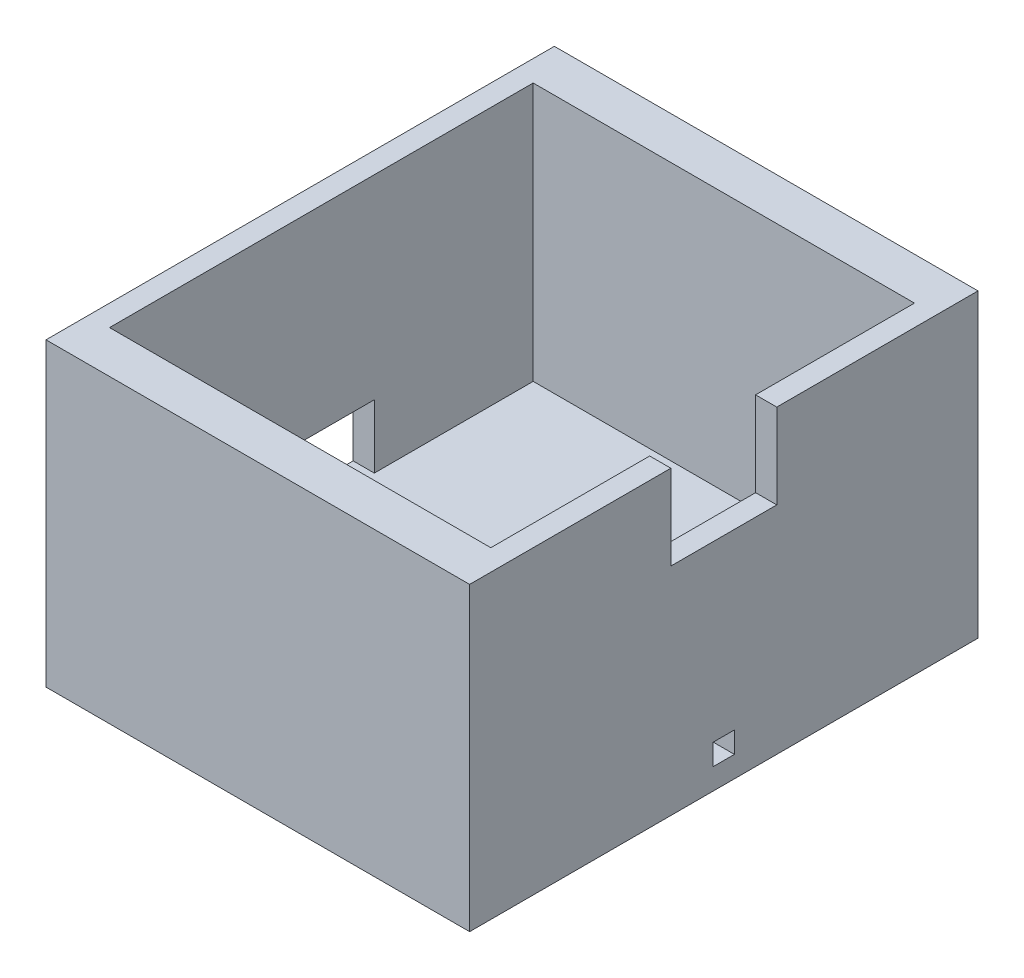
ISO-10303-21;
HEADER;
FILE_DESCRIPTION(('STEP AP214'),'2;1');
FILE_NAME('part.step','',(''),(''),'','','');
FILE_SCHEMA(('AUTOMOTIVE_DESIGN { 1 0 10303 214 1 1 1 1 }'));
ENDSEC;
DATA;
#1=APPLICATION_CONTEXT('core data for automotive mechanical design processes');
#2=APPLICATION_PROTOCOL_DEFINITION('international standard','automotive_design',2000,#1);
#3=PRODUCT_CONTEXT('',#1,'mechanical');
#4=PRODUCT('Part','Part','',(#3));
#5=PRODUCT_RELATED_PRODUCT_CATEGORY('part','',(#4));
#6=PRODUCT_DEFINITION_FORMATION('','',#4);
#7=PRODUCT_DEFINITION_CONTEXT('part definition',#1,'design');
#8=PRODUCT_DEFINITION('design','',#6,#7);
#9=PRODUCT_DEFINITION_SHAPE('','',#8);
#10=(LENGTH_UNIT() NAMED_UNIT(*) SI_UNIT(.MILLI.,.METRE.));
#11=(NAMED_UNIT(*) PLANE_ANGLE_UNIT() SI_UNIT($,.RADIAN.));
#12=(NAMED_UNIT(*) SI_UNIT($,.STERADIAN.) SOLID_ANGLE_UNIT());
#13=UNCERTAINTY_MEASURE_WITH_UNIT(LENGTH_MEASURE(1.E-05),#10,'distance_accuracy_value','');
#14=(GEOMETRIC_REPRESENTATION_CONTEXT(3) GLOBAL_UNCERTAINTY_ASSIGNED_CONTEXT((#13)) GLOBAL_UNIT_ASSIGNED_CONTEXT((#10,
#11,#12)) REPRESENTATION_CONTEXT('',''));
#15=CARTESIAN_POINT('',(0.,0.,0.));
#16=DIRECTION('',(0.,0.,1.));
#17=DIRECTION('',(1.,0.,0.));
#18=AXIS2_PLACEMENT_3D('',#15,#16,#17);
#19=CARTESIAN_POINT('',(0.,10.,0.));
#20=DIRECTION('',(0.,1.,0.));
#21=DIRECTION('',(0.,0.,1.));
#22=AXIS2_PLACEMENT_3D('',#19,#20,#21);
#23=PLANE('',#22);
#24=DIRECTION('',(0.,0.,1.));
#25=VECTOR('',#24,1.);
#26=CARTESIAN_POINT('',(-45.,10.,-50.));
#27=LINE('',#26,#25);
#28=CARTESIAN_POINT('',(-45.,10.,-50.));
#29=VERTEX_POINT('',#28);
#30=CARTESIAN_POINT('',(-45.,10.,-12.5));
#31=VERTEX_POINT('',#30);
#32=EDGE_CURVE('E237',#29,#31,#27,.T.);
#33=ORIENTED_EDGE('',*,*,#32,.T.);
#34=DIRECTION('',(-1.,0.,0.));
#35=VECTOR('',#34,1.);
#36=CARTESIAN_POINT('',(-21.,10.,-12.5));
#37=LINE('',#36,#35);
#38=CARTESIAN_POINT('',(-50.,10.,-12.5));
#39=VERTEX_POINT('',#38);
#40=EDGE_CURVE('E225',#31,#39,#37,.T.);
#41=ORIENTED_EDGE('',*,*,#40,.T.);
#42=DIRECTION('',(0.,0.,1.));
#43=VECTOR('',#42,1.);
#44=CARTESIAN_POINT('',(-50.,10.,-12.5));
#45=LINE('',#44,#43);
#46=CARTESIAN_POINT('',(-50.,10.,-2.5));
#47=VERTEX_POINT('',#46);
#48=EDGE_CURVE('E216',#39,#47,#45,.T.);
#49=ORIENTED_EDGE('',*,*,#48,.T.);
#50=DIRECTION('',(-1.,0.,0.));
#51=VECTOR('',#50,1.);
#52=CARTESIAN_POINT('',(-50.,10.,-2.5));
#53=LINE('',#52,#51);
#54=CARTESIAN_POINT('',(45.,10.,-2.5));
#55=VERTEX_POINT('',#54);
#56=EDGE_CURVE('E311',#55,#47,#53,.T.);
#57=ORIENTED_EDGE('',*,*,#56,.F.);
#58=DIRECTION('',(0.,0.,-1.));
#59=VECTOR('',#58,1.);
#60=CARTESIAN_POINT('',(45.,10.,-50.));
#61=LINE('',#60,#59);
#62=CARTESIAN_POINT('',(45.,10.,-50.));
#63=VERTEX_POINT('',#62);
#64=EDGE_CURVE('E249',#55,#63,#61,.T.);
#65=ORIENTED_EDGE('',*,*,#64,.T.);
#66=DIRECTION('',(-1.,0.,0.));
#67=VECTOR('',#66,1.);
#68=CARTESIAN_POINT('',(-45.,10.,-50.));
#69=LINE('',#68,#67);
#70=EDGE_CURVE('E253',#63,#29,#69,.T.);
#71=ORIENTED_EDGE('',*,*,#70,.T.);
#72=EDGE_LOOP('',(#33,#41,#49,#57,#65,#71));
#73=FACE_BOUND('',#72,.T.);
#74=ADVANCED_FACE('F39',(#73),#23,.T.);
#75=CARTESIAN_POINT('',(-50.,10.,60.));
#76=DIRECTION('',(1.,0.,0.));
#77=DIRECTION('',(0.,0.,-1.));
#78=AXIS2_PLACEMENT_3D('',#75,#76,#77);
#79=PLANE('',#78);
#80=DIRECTION('',(0.,1.,0.));
#81=VECTOR('',#80,1.);
#82=CARTESIAN_POINT('',(-50.,10.,12.5));
#83=LINE('',#82,#81);
#84=CARTESIAN_POINT('',(-50.,10.,12.5));
#85=VERTEX_POINT('',#84);
#86=CARTESIAN_POINT('',(-50.,25.,12.5));
#87=VERTEX_POINT('',#86);
#88=EDGE_CURVE('E219',#85,#87,#83,.T.);
#89=ORIENTED_EDGE('',*,*,#88,.F.);
#90=CARTESIAN_POINT('',(-50.,10.,2.5));
#91=VERTEX_POINT('',#90);
#92=EDGE_CURVE('E215',#91,#85,#45,.T.);
#93=ORIENTED_EDGE('',*,*,#92,.F.);
#94=DIRECTION('',(0.,1.,0.));
#95=VECTOR('',#94,1.);
#96=CARTESIAN_POINT('',(-50.,5.,2.5));
#97=LINE('',#96,#95);
#98=CARTESIAN_POINT('',(-50.,5.,2.5));
#99=VERTEX_POINT('',#98);
#100=EDGE_CURVE('E308',#99,#91,#97,.T.);
#101=ORIENTED_EDGE('',*,*,#100,.F.);
#102=DIRECTION('',(0.,0.,1.));
#103=VECTOR('',#102,1.);
#104=CARTESIAN_POINT('',(-50.,5.,-2.5));
#105=LINE('',#104,#103);
#106=CARTESIAN_POINT('',(-50.,5.,-2.5));
#107=VERTEX_POINT('',#106);
#108=EDGE_CURVE('E296',#107,#99,#105,.T.);
#109=ORIENTED_EDGE('',*,*,#108,.F.);
#110=DIRECTION('',(0.,1.,0.));
#111=VECTOR('',#110,1.);
#112=CARTESIAN_POINT('',(-50.,5.,-2.5));
#113=LINE('',#112,#111);
#114=EDGE_CURVE('E314',#107,#47,#113,.T.);
#115=ORIENTED_EDGE('',*,*,#114,.T.);
#116=ORIENTED_EDGE('',*,*,#48,.F.);
#117=DIRECTION('',(0.,-1.,0.));
#118=VECTOR('',#117,1.);
#119=CARTESIAN_POINT('',(-50.,10.,-12.5));
#120=LINE('',#119,#118);
#121=CARTESIAN_POINT('',(-50.,25.,-12.5));
#122=VERTEX_POINT('',#121);
#123=EDGE_CURVE('E208',#122,#39,#120,.T.);
#124=ORIENTED_EDGE('',*,*,#123,.F.);
#125=DIRECTION('',(0.,0.,-1.));
#126=VECTOR('',#125,1.);
#127=CARTESIAN_POINT('',(-50.,25.,-12.5));
#128=LINE('',#127,#126);
#129=EDGE_CURVE('E222',#87,#122,#128,.T.);
#130=ORIENTED_EDGE('',*,*,#129,.F.);
#131=EDGE_LOOP('',(#89,#93,#101,#109,#115,#116,#124,#130));
#132=FACE_BOUND('',#131,.T.);
#133=DIRECTION('',(0.,0.,1.));
#134=VECTOR('',#133,1.);
#135=CARTESIAN_POINT('',(-50.,71.,-60.));
#136=LINE('',#135,#134);
#137=CARTESIAN_POINT('',(-50.,71.,-60.));
#138=VERTEX_POINT('',#137);
#139=CARTESIAN_POINT('',(-50.,71.,60.));
#140=VERTEX_POINT('',#139);
#141=EDGE_CURVE('E272',#138,#140,#136,.T.);
#142=ORIENTED_EDGE('',*,*,#141,.F.);
#143=DIRECTION('',(0.,-1.,0.));
#144=VECTOR('',#143,1.);
#145=CARTESIAN_POINT('',(-50.,10.,-60.));
#146=LINE('',#145,#144);
#147=CARTESIAN_POINT('',(-50.,0.,-60.));
#148=VERTEX_POINT('',#147);
#149=EDGE_CURVE('E334',#138,#148,#146,.T.);
#150=ORIENTED_EDGE('',*,*,#149,.T.);
#151=DIRECTION('',(0.,0.,1.));
#152=VECTOR('',#151,1.);
#153=CARTESIAN_POINT('',(-50.,0.,60.));
#154=LINE('',#153,#152);
#155=CARTESIAN_POINT('',(-50.,0.,60.));
#156=VERTEX_POINT('',#155);
#157=EDGE_CURVE('E317',#148,#156,#154,.T.);
#158=ORIENTED_EDGE('',*,*,#157,.T.);
#159=DIRECTION('',(0.,-1.,0.));
#160=VECTOR('',#159,1.);
#161=CARTESIAN_POINT('',(-50.,10.,60.));
#162=LINE('',#161,#160);
#163=EDGE_CURVE('E343',#140,#156,#162,.T.);
#164=ORIENTED_EDGE('',*,*,#163,.F.);
#165=EDGE_LOOP('',(#142,#150,#158,#164));
#166=FACE_BOUND('',#165,.T.);
#167=ADVANCED_FACE('F41',(#132,#166),#79,.F.);
#168=CARTESIAN_POINT('',(50.,10.,60.));
#169=DIRECTION('',(0.,0.,-1.));
#170=DIRECTION('',(-1.,0.,0.));
#171=AXIS2_PLACEMENT_3D('',#168,#169,#170);
#172=PLANE('',#171);
#173=DIRECTION('',(1.,0.,0.));
#174=VECTOR('',#173,1.);
#175=CARTESIAN_POINT('',(50.,0.,60.));
#176=LINE('',#175,#174);
#177=CARTESIAN_POINT('',(50.,0.,60.));
#178=VERTEX_POINT('',#177);
#179=EDGE_CURVE('E328',#156,#178,#176,.T.);
#180=ORIENTED_EDGE('',*,*,#179,.T.);
#181=DIRECTION('',(0.,-1.,0.));
#182=VECTOR('',#181,1.);
#183=CARTESIAN_POINT('',(50.,10.,60.));
#184=LINE('',#183,#182);
#185=CARTESIAN_POINT('',(50.,71.,60.));
#186=VERTEX_POINT('',#185);
#187=EDGE_CURVE('E340',#186,#178,#184,.T.);
#188=ORIENTED_EDGE('',*,*,#187,.F.);
#189=DIRECTION('',(1.,0.,0.));
#190=VECTOR('',#189,1.);
#191=CARTESIAN_POINT('',(50.,71.,60.));
#192=LINE('',#191,#190);
#193=EDGE_CURVE('E275',#140,#186,#192,.T.);
#194=ORIENTED_EDGE('',*,*,#193,.F.);
#195=ORIENTED_EDGE('',*,*,#163,.T.);
#196=EDGE_LOOP('',(#180,#188,#194,#195));
#197=FACE_BOUND('',#196,.T.);
#198=ADVANCED_FACE('F443',(#197),#172,.F.);
#199=CARTESIAN_POINT('',(50.,10.,60.));
#200=DIRECTION('',(-1.,0.,0.));
#201=DIRECTION('',(0.,0.,1.));
#202=AXIS2_PLACEMENT_3D('',#199,#200,#201);
#203=PLANE('',#202);
#204=DIRECTION('',(0.,0.,-1.));
#205=VECTOR('',#204,1.);
#206=CARTESIAN_POINT('',(50.,51.,12.5));
#207=LINE('',#206,#205);
#208=CARTESIAN_POINT('',(50.,51.,12.5));
#209=VERTEX_POINT('',#208);
#210=CARTESIAN_POINT('',(50.,51.,-12.5));
#211=VERTEX_POINT('',#210);
#212=EDGE_CURVE('E184',#209,#211,#207,.T.);
#213=ORIENTED_EDGE('',*,*,#212,.F.);
#214=DIRECTION('',(0.,-1.,0.));
#215=VECTOR('',#214,1.);
#216=CARTESIAN_POINT('',(50.,71.,12.5));
#217=LINE('',#216,#215);
#218=CARTESIAN_POINT('',(50.,71.,12.5));
#219=VERTEX_POINT('',#218);
#220=EDGE_CURVE('E193',#219,#209,#217,.T.);
#221=ORIENTED_EDGE('',*,*,#220,.F.);
#222=DIRECTION('',(0.,0.,-1.));
#223=VECTOR('',#222,1.);
#224=CARTESIAN_POINT('',(50.,71.,-60.));
#225=LINE('',#224,#223);
#226=EDGE_CURVE('E279',#186,#219,#225,.T.);
#227=ORIENTED_EDGE('',*,*,#226,.F.);
#228=ORIENTED_EDGE('',*,*,#187,.T.);
#229=DIRECTION('',(0.,0.,-1.));
#230=VECTOR('',#229,1.);
#231=CARTESIAN_POINT('',(50.,0.,60.));
#232=LINE('',#231,#230);
#233=CARTESIAN_POINT('',(50.,0.,-60.));
#234=VERTEX_POINT('',#233);
#235=EDGE_CURVE('E330',#178,#234,#232,.T.);
#236=ORIENTED_EDGE('',*,*,#235,.T.);
#237=DIRECTION('',(0.,-1.,0.));
#238=VECTOR('',#237,1.);
#239=CARTESIAN_POINT('',(50.,10.,-60.));
#240=LINE('',#239,#238);
#241=CARTESIAN_POINT('',(50.,71.,-60.));
#242=VERTEX_POINT('',#241);
#243=EDGE_CURVE('E337',#242,#234,#240,.T.);
#244=ORIENTED_EDGE('',*,*,#243,.F.);
#245=CARTESIAN_POINT('',(50.,71.,-12.5));
#246=VERTEX_POINT('',#245);
#247=EDGE_CURVE('E278',#246,#242,#225,.T.);
#248=ORIENTED_EDGE('',*,*,#247,.F.);
#249=DIRECTION('',(0.,1.,0.));
#250=VECTOR('',#249,1.);
#251=CARTESIAN_POINT('',(50.,71.,-12.5));
#252=LINE('',#251,#250);
#253=EDGE_CURVE('E190',#211,#246,#252,.T.);
#254=ORIENTED_EDGE('',*,*,#253,.F.);
#255=EDGE_LOOP('',(#213,#221,#227,#228,#236,#244,#248,#254));
#256=FACE_BOUND('',#255,.T.);
#257=DIRECTION('',(0.,0.,-1.));
#258=VECTOR('',#257,1.);
#259=CARTESIAN_POINT('',(50.,10.,-60.));
#260=LINE('',#259,#258);
#261=CARTESIAN_POINT('',(50.,10.,2.5));
#262=VERTEX_POINT('',#261);
#263=CARTESIAN_POINT('',(50.,10.,-2.5));
#264=VERTEX_POINT('',#263);
#265=EDGE_CURVE('E268',#262,#264,#260,.T.);
#266=ORIENTED_EDGE('',*,*,#265,.T.);
#267=DIRECTION('',(0.,1.,0.));
#268=VECTOR('',#267,1.);
#269=CARTESIAN_POINT('',(50.,5.,-2.5));
#270=LINE('',#269,#268);
#271=CARTESIAN_POINT('',(50.,5.,-2.5));
#272=VERTEX_POINT('',#271);
#273=EDGE_CURVE('E318',#272,#264,#270,.T.);
#274=ORIENTED_EDGE('',*,*,#273,.F.);
#275=DIRECTION('',(0.,0.,-1.));
#276=VECTOR('',#275,1.);
#277=CARTESIAN_POINT('',(50.,5.,-2.5));
#278=LINE('',#277,#276);
#279=CARTESIAN_POINT('',(50.,5.,2.5));
#280=VERTEX_POINT('',#279);
#281=EDGE_CURVE('E303',#280,#272,#278,.T.);
#282=ORIENTED_EDGE('',*,*,#281,.F.);
#283=DIRECTION('',(0.,1.,0.));
#284=VECTOR('',#283,1.);
#285=CARTESIAN_POINT('',(50.,5.,2.5));
#286=LINE('',#285,#284);
#287=EDGE_CURVE('E321',#280,#262,#286,.T.);
#288=ORIENTED_EDGE('',*,*,#287,.T.);
#289=EDGE_LOOP('',(#266,#274,#282,#288));
#290=FACE_BOUND('',#289,.T.);
#291=ADVANCED_FACE('F201',(#256,#290),#203,.F.);
#292=CARTESIAN_POINT('',(50.,10.,-60.));
#293=DIRECTION('',(0.,0.,1.));
#294=DIRECTION('',(1.,0.,0.));
#295=AXIS2_PLACEMENT_3D('',#292,#293,#294);
#296=PLANE('',#295);
#297=DIRECTION('',(-1.,0.,0.));
#298=VECTOR('',#297,1.);
#299=CARTESIAN_POINT('',(50.,0.,-60.));
#300=LINE('',#299,#298);
#301=EDGE_CURVE('E332',#234,#148,#300,.T.);
#302=ORIENTED_EDGE('',*,*,#301,.T.);
#303=ORIENTED_EDGE('',*,*,#149,.F.);
#304=DIRECTION('',(-1.,0.,0.));
#305=VECTOR('',#304,1.);
#306=CARTESIAN_POINT('',(50.,71.,-60.));
#307=LINE('',#306,#305);
#308=EDGE_CURVE('E269',#242,#138,#307,.T.);
#309=ORIENTED_EDGE('',*,*,#308,.F.);
#310=ORIENTED_EDGE('',*,*,#243,.T.);
#311=EDGE_LOOP('',(#302,#303,#309,#310));
#312=FACE_BOUND('',#311,.T.);
#313=ADVANCED_FACE('F372',(#312),#296,.F.);
#314=DIRECTION('',(-1.,0.,0.));
#315=VECTOR('',#314,1.);
#316=CARTESIAN_POINT('',(-21.,10.,12.5));
#317=LINE('',#316,#315);
#318=CARTESIAN_POINT('',(-45.,10.,12.5));
#319=VERTEX_POINT('',#318);
#320=EDGE_CURVE('E231',#319,#85,#317,.T.);
#321=ORIENTED_EDGE('',*,*,#320,.F.);
#322=CARTESIAN_POINT('',(-45.,10.,50.));
#323=VERTEX_POINT('',#322);
#324=EDGE_CURVE('E256',#319,#323,#27,.T.);
#325=ORIENTED_EDGE('',*,*,#324,.T.);
#326=DIRECTION('',(1.,0.,0.));
#327=VECTOR('',#326,1.);
#328=CARTESIAN_POINT('',(45.,10.,50.));
#329=LINE('',#328,#327);
#330=CARTESIAN_POINT('',(45.,10.,50.));
#331=VERTEX_POINT('',#330);
#332=EDGE_CURVE('E228',#323,#331,#329,.T.);
#333=ORIENTED_EDGE('',*,*,#332,.T.);
#334=CARTESIAN_POINT('',(45.,10.,2.5));
#335=VERTEX_POINT('',#334);
#336=EDGE_CURVE('E250',#331,#335,#61,.T.);
#337=ORIENTED_EDGE('',*,*,#336,.T.);
#338=DIRECTION('',(1.,0.,0.));
#339=VECTOR('',#338,1.);
#340=CARTESIAN_POINT('',(-50.,10.,2.5));
#341=LINE('',#340,#339);
#342=EDGE_CURVE('E309',#91,#335,#341,.T.);
#343=ORIENTED_EDGE('',*,*,#342,.F.);
#344=ORIENTED_EDGE('',*,*,#92,.T.);
#345=EDGE_LOOP('',(#321,#325,#333,#337,#343,#344));
#346=FACE_BOUND('',#345,.T.);
#347=CARTESIAN_POINT('',(13.1,10.,18.7266881758464));
#348=DIRECTION('',(0.,1.,0.));
#349=DIRECTION('',(0.,0.,1.));
#350=AXIS2_PLACEMENT_3D('',#347,#348,#349);
#351=CIRCLE('',#350,2.);
#352=CARTESIAN_POINT('',(13.1,10.,20.7266881758464));
#353=VERTEX_POINT('',#352);
#354=EDGE_CURVE('E288',#353,#353,#351,.T.);
#355=ORIENTED_EDGE('',*,*,#354,.F.);
#356=EDGE_LOOP('',(#355));
#357=FACE_BOUND('',#356,.T.);
#358=CARTESIAN_POINT('',(-36.9,10.,18.7266881758464));
#359=DIRECTION('',(0.,1.,0.));
#360=DIRECTION('',(0.,0.,1.));
#361=AXIS2_PLACEMENT_3D('',#358,#359,#360);
#362=CIRCLE('',#361,2.);
#363=CARTESIAN_POINT('',(-36.9,10.,20.7266881758464));
#364=VERTEX_POINT('',#363);
#365=EDGE_CURVE('E291',#364,#364,#362,.T.);
#366=ORIENTED_EDGE('',*,*,#365,.F.);
#367=EDGE_LOOP('',(#366));
#368=FACE_BOUND('',#367,.T.);
#369=ADVANCED_FACE('F388',(#346,#357,#368),#23,.T.);
#370=CARTESIAN_POINT('',(0.,0.,0.));
#371=DIRECTION('',(0.,1.,0.));
#372=DIRECTION('',(0.,0.,1.));
#373=AXIS2_PLACEMENT_3D('',#370,#371,#372);
#374=PLANE('',#373);
#375=CARTESIAN_POINT('',(13.1,0.,18.7266881758464));
#376=DIRECTION('',(0.,1.,0.));
#377=DIRECTION('',(0.,0.,1.));
#378=AXIS2_PLACEMENT_3D('',#375,#376,#377);
#379=CIRCLE('',#378,2.);
#380=CARTESIAN_POINT('',(13.1,0.,20.7266881758464));
#381=VERTEX_POINT('',#380);
#382=EDGE_CURVE('E284',#381,#381,#379,.T.);
#383=ORIENTED_EDGE('',*,*,#382,.T.);
#384=EDGE_LOOP('',(#383));
#385=FACE_BOUND('',#384,.T.);
#386=CARTESIAN_POINT('',(-36.9,0.,18.7266881758464));
#387=DIRECTION('',(0.,1.,0.));
#388=DIRECTION('',(0.,0.,1.));
#389=AXIS2_PLACEMENT_3D('',#386,#387,#388);
#390=CIRCLE('',#389,2.);
#391=CARTESIAN_POINT('',(-36.9,0.,20.7266881758464));
#392=VERTEX_POINT('',#391);
#393=EDGE_CURVE('E281',#392,#392,#390,.T.);
#394=ORIENTED_EDGE('',*,*,#393,.T.);
#395=EDGE_LOOP('',(#394));
#396=FACE_BOUND('',#395,.T.);
#397=ORIENTED_EDGE('',*,*,#157,.F.);
#398=ORIENTED_EDGE('',*,*,#301,.F.);
#399=ORIENTED_EDGE('',*,*,#235,.F.);
#400=ORIENTED_EDGE('',*,*,#179,.F.);
#401=EDGE_LOOP('',(#397,#398,#399,#400));
#402=FACE_BOUND('',#401,.T.);
#403=ADVANCED_FACE('F370',(#385,#396,#402),#374,.F.);
#404=CARTESIAN_POINT('',(-50.,5.,-2.5));
#405=DIRECTION('',(0.,0.,-1.));
#406=DIRECTION('',(-1.,0.,0.));
#407=AXIS2_PLACEMENT_3D('',#404,#405,#406);
#408=PLANE('',#407);
#409=EDGE_CURVE('E300',#264,#55,#53,.T.);
#410=ORIENTED_EDGE('',*,*,#409,.T.);
#411=ORIENTED_EDGE('',*,*,#56,.T.);
#412=ORIENTED_EDGE('',*,*,#114,.F.);
#413=DIRECTION('',(-1.,0.,0.));
#414=VECTOR('',#413,1.);
#415=CARTESIAN_POINT('',(-50.,5.,-2.5));
#416=LINE('',#415,#414);
#417=EDGE_CURVE('E305',#272,#107,#416,.T.);
#418=ORIENTED_EDGE('',*,*,#417,.F.);
#419=ORIENTED_EDGE('',*,*,#273,.T.);
#420=EDGE_LOOP('',(#410,#411,#412,#418,#419));
#421=FACE_BOUND('',#420,.T.);
#422=ADVANCED_FACE('F414',(#421),#408,.F.);
#423=CARTESIAN_POINT('',(-50.,5.,2.5));
#424=DIRECTION('',(0.,0.,1.));
#425=DIRECTION('',(1.,0.,0.));
#426=AXIS2_PLACEMENT_3D('',#423,#424,#425);
#427=PLANE('',#426);
#428=ORIENTED_EDGE('',*,*,#342,.T.);
#429=EDGE_CURVE('E287',#335,#262,#341,.T.);
#430=ORIENTED_EDGE('',*,*,#429,.T.);
#431=ORIENTED_EDGE('',*,*,#287,.F.);
#432=DIRECTION('',(1.,0.,0.));
#433=VECTOR('',#432,1.);
#434=CARTESIAN_POINT('',(-50.,5.,2.5));
#435=LINE('',#434,#433);
#436=EDGE_CURVE('E299',#99,#280,#435,.T.);
#437=ORIENTED_EDGE('',*,*,#436,.F.);
#438=ORIENTED_EDGE('',*,*,#100,.T.);
#439=EDGE_LOOP('',(#428,#430,#431,#437,#438));
#440=FACE_BOUND('',#439,.T.);
#441=ADVANCED_FACE('F422',(#440),#427,.F.);
#442=CARTESIAN_POINT('',(0.,5.,0.));
#443=DIRECTION('',(0.,1.,0.));
#444=DIRECTION('',(0.,0.,1.));
#445=AXIS2_PLACEMENT_3D('',#442,#443,#444);
#446=PLANE('',#445);
#447=ORIENTED_EDGE('',*,*,#108,.T.);
#448=ORIENTED_EDGE('',*,*,#436,.T.);
#449=ORIENTED_EDGE('',*,*,#281,.T.);
#450=ORIENTED_EDGE('',*,*,#417,.T.);
#451=EDGE_LOOP('',(#447,#448,#449,#450));
#452=FACE_BOUND('',#451,.T.);
#453=ADVANCED_FACE('F417',(#452),#446,.T.);
#454=CARTESIAN_POINT('',(-36.9,0.,18.7266881758464));
#455=DIRECTION('',(0.,1.,0.));
#456=DIRECTION('',(0.,0.,1.));
#457=AXIS2_PLACEMENT_3D('',#454,#455,#456);
#458=CYLINDRICAL_SURFACE('',#457,2.);
#459=ORIENTED_EDGE('',*,*,#393,.F.);
#460=EDGE_LOOP('',(#459));
#461=FACE_BOUND('',#460,.T.);
#462=ORIENTED_EDGE('',*,*,#365,.T.);
#463=EDGE_LOOP('',(#462));
#464=FACE_BOUND('',#463,.T.);
#465=ADVANCED_FACE('F472',(#461,#464),#458,.F.);
#466=CARTESIAN_POINT('',(13.1,0.,18.7266881758464));
#467=DIRECTION('',(0.,1.,0.));
#468=DIRECTION('',(0.,0.,1.));
#469=AXIS2_PLACEMENT_3D('',#466,#467,#468);
#470=CYLINDRICAL_SURFACE('',#469,2.);
#471=ORIENTED_EDGE('',*,*,#382,.F.);
#472=EDGE_LOOP('',(#471));
#473=FACE_BOUND('',#472,.T.);
#474=ORIENTED_EDGE('',*,*,#354,.T.);
#475=EDGE_LOOP('',(#474));
#476=FACE_BOUND('',#475,.T.);
#477=ADVANCED_FACE('F468',(#473,#476),#470,.F.);
#478=CARTESIAN_POINT('',(0.,10.,0.));
#479=DIRECTION('',(0.,1.,0.));
#480=DIRECTION('',(0.,0.,1.));
#481=AXIS2_PLACEMENT_3D('',#478,#479,#480);
#482=PLANE('',#481);
#483=EDGE_CURVE('E62',#335,#55,#61,.T.);
#484=ORIENTED_EDGE('',*,*,#483,.T.);
#485=ORIENTED_EDGE('',*,*,#409,.F.);
#486=ORIENTED_EDGE('',*,*,#265,.F.);
#487=ORIENTED_EDGE('',*,*,#429,.F.);
#488=EDGE_LOOP('',(#484,#485,#486,#487));
#489=FACE_BOUND('',#488,.T.);
#490=ADVANCED_FACE('F419',(#489),#482,.F.);
#491=CARTESIAN_POINT('',(0.,71.,0.));
#492=DIRECTION('',(0.,1.,0.));
#493=DIRECTION('',(0.,0.,1.));
#494=AXIS2_PLACEMENT_3D('',#491,#492,#493);
#495=PLANE('',#494);
#496=DIRECTION('',(1.,0.,0.));
#497=VECTOR('',#496,1.);
#498=CARTESIAN_POINT('',(21.,71.,12.5));
#499=LINE('',#498,#497);
#500=CARTESIAN_POINT('',(45.,71.,12.5));
#501=VERTEX_POINT('',#500);
#502=EDGE_CURVE('E196',#501,#219,#499,.T.);
#503=ORIENTED_EDGE('',*,*,#502,.F.);
#504=DIRECTION('',(0.,0.,-1.));
#505=VECTOR('',#504,1.);
#506=CARTESIAN_POINT('',(45.,71.,-50.));
#507=LINE('',#506,#505);
#508=CARTESIAN_POINT('',(45.,71.,50.));
#509=VERTEX_POINT('',#508);
#510=EDGE_CURVE('E238',#509,#501,#507,.T.);
#511=ORIENTED_EDGE('',*,*,#510,.F.);
#512=DIRECTION('',(1.,0.,0.));
#513=VECTOR('',#512,1.);
#514=CARTESIAN_POINT('',(45.,71.,50.));
#515=LINE('',#514,#513);
#516=CARTESIAN_POINT('',(-45.,71.,50.));
#517=VERTEX_POINT('',#516);
#518=EDGE_CURVE('E234',#517,#509,#515,.T.);
#519=ORIENTED_EDGE('',*,*,#518,.F.);
#520=DIRECTION('',(0.,0.,1.));
#521=VECTOR('',#520,1.);
#522=CARTESIAN_POINT('',(-45.,71.,-50.));
#523=LINE('',#522,#521);
#524=CARTESIAN_POINT('',(-45.,71.,-50.));
#525=VERTEX_POINT('',#524);
#526=EDGE_CURVE('E244',#525,#517,#523,.T.);
#527=ORIENTED_EDGE('',*,*,#526,.F.);
#528=DIRECTION('',(-1.,0.,0.));
#529=VECTOR('',#528,1.);
#530=CARTESIAN_POINT('',(-45.,71.,-50.));
#531=LINE('',#530,#529);
#532=CARTESIAN_POINT('',(45.,71.,-50.));
#533=VERTEX_POINT('',#532);
#534=EDGE_CURVE('E241',#533,#525,#531,.T.);
#535=ORIENTED_EDGE('',*,*,#534,.F.);
#536=CARTESIAN_POINT('',(45.,71.,-12.5));
#537=VERTEX_POINT('',#536);
#538=EDGE_CURVE('E236',#537,#533,#507,.T.);
#539=ORIENTED_EDGE('',*,*,#538,.F.);
#540=DIRECTION('',(1.,0.,0.));
#541=VECTOR('',#540,1.);
#542=CARTESIAN_POINT('',(21.,71.,-12.5));
#543=LINE('',#542,#541);
#544=EDGE_CURVE('E209',#537,#246,#543,.T.);
#545=ORIENTED_EDGE('',*,*,#544,.T.);
#546=ORIENTED_EDGE('',*,*,#247,.T.);
#547=ORIENTED_EDGE('',*,*,#308,.T.);
#548=ORIENTED_EDGE('',*,*,#141,.T.);
#549=ORIENTED_EDGE('',*,*,#193,.T.);
#550=ORIENTED_EDGE('',*,*,#226,.T.);
#551=EDGE_LOOP('',(#503,#511,#519,#527,#535,#539,#545,#546,#547,#548,#549,#550));
#552=FACE_BOUND('',#551,.T.);
#553=ADVANCED_FACE('F361',(#552),#495,.T.);
#554=CARTESIAN_POINT('',(45.,71.,50.));
#555=DIRECTION('',(0.,0.,-1.));
#556=DIRECTION('',(-1.,0.,0.));
#557=AXIS2_PLACEMENT_3D('',#554,#555,#556);
#558=PLANE('',#557);
#559=ORIENTED_EDGE('',*,*,#332,.F.);
#560=DIRECTION('',(0.,-1.,0.));
#561=VECTOR('',#560,1.);
#562=CARTESIAN_POINT('',(-45.,71.,50.));
#563=LINE('',#562,#561);
#564=EDGE_CURVE('E246',#517,#323,#563,.T.);
#565=ORIENTED_EDGE('',*,*,#564,.F.);
#566=ORIENTED_EDGE('',*,*,#518,.T.);
#567=DIRECTION('',(0.,-1.,0.));
#568=VECTOR('',#567,1.);
#569=CARTESIAN_POINT('',(45.,71.,50.));
#570=LINE('',#569,#568);
#571=EDGE_CURVE('E265',#509,#331,#570,.T.);
#572=ORIENTED_EDGE('',*,*,#571,.T.);
#573=EDGE_LOOP('',(#559,#565,#566,#572));
#574=FACE_BOUND('',#573,.T.);
#575=ADVANCED_FACE('F396',(#574),#558,.T.);
#576=CARTESIAN_POINT('',(45.,71.,-50.));
#577=DIRECTION('',(-1.,0.,0.));
#578=DIRECTION('',(0.,0.,1.));
#579=AXIS2_PLACEMENT_3D('',#576,#577,#578);
#580=PLANE('',#579);
#581=DIRECTION('',(0.,1.,0.));
#582=VECTOR('',#581,1.);
#583=CARTESIAN_POINT('',(45.,71.,12.5));
#584=LINE('',#583,#582);
#585=CARTESIAN_POINT('',(45.,51.,12.5));
#586=VERTEX_POINT('',#585);
#587=EDGE_CURVE('E11',#586,#501,#584,.T.);
#588=ORIENTED_EDGE('',*,*,#587,.F.);
#589=DIRECTION('',(0.,0.,1.));
#590=VECTOR('',#589,1.);
#591=CARTESIAN_POINT('',(45.,51.,-50.));
#592=LINE('',#591,#590);
#593=CARTESIAN_POINT('',(45.,51.,-12.5));
#594=VERTEX_POINT('',#593);
#595=EDGE_CURVE('E187',#594,#586,#592,.T.);
#596=ORIENTED_EDGE('',*,*,#595,.F.);
#597=DIRECTION('',(0.,-1.,0.));
#598=VECTOR('',#597,1.);
#599=CARTESIAN_POINT('',(45.,71.,-12.5));
#600=LINE('',#599,#598);
#601=EDGE_CURVE('E47',#537,#594,#600,.T.);
#602=ORIENTED_EDGE('',*,*,#601,.F.);
#603=ORIENTED_EDGE('',*,*,#538,.T.);
#604=DIRECTION('',(0.,-1.,0.));
#605=VECTOR('',#604,1.);
#606=CARTESIAN_POINT('',(45.,71.,-50.));
#607=LINE('',#606,#605);
#608=EDGE_CURVE('E263',#533,#63,#607,.T.);
#609=ORIENTED_EDGE('',*,*,#608,.T.);
#610=ORIENTED_EDGE('',*,*,#64,.F.);
#611=ORIENTED_EDGE('',*,*,#483,.F.);
#612=ORIENTED_EDGE('',*,*,#336,.F.);
#613=ORIENTED_EDGE('',*,*,#571,.F.);
#614=ORIENTED_EDGE('',*,*,#510,.T.);
#615=EDGE_LOOP('',(#588,#596,#602,#603,#609,#610,#611,#612,#613,#614));
#616=FACE_BOUND('',#615,.T.);
#617=ADVANCED_FACE('F357',(#616),#580,.T.);
#618=CARTESIAN_POINT('',(-45.,71.,-50.));
#619=DIRECTION('',(0.,0.,1.));
#620=DIRECTION('',(1.,0.,0.));
#621=AXIS2_PLACEMENT_3D('',#618,#619,#620);
#622=PLANE('',#621);
#623=ORIENTED_EDGE('',*,*,#70,.F.);
#624=ORIENTED_EDGE('',*,*,#608,.F.);
#625=ORIENTED_EDGE('',*,*,#534,.T.);
#626=DIRECTION('',(0.,-1.,0.));
#627=VECTOR('',#626,1.);
#628=CARTESIAN_POINT('',(-45.,71.,-50.));
#629=LINE('',#628,#627);
#630=EDGE_CURVE('E261',#525,#29,#629,.T.);
#631=ORIENTED_EDGE('',*,*,#630,.T.);
#632=EDGE_LOOP('',(#623,#624,#625,#631));
#633=FACE_BOUND('',#632,.T.);
#634=ADVANCED_FACE('F381',(#633),#622,.T.);
#635=CARTESIAN_POINT('',(-45.,71.,-50.));
#636=DIRECTION('',(1.,0.,0.));
#637=DIRECTION('',(0.,0.,-1.));
#638=AXIS2_PLACEMENT_3D('',#635,#636,#637);
#639=PLANE('',#638);
#640=DIRECTION('',(0.,1.,0.));
#641=VECTOR('',#640,1.);
#642=CARTESIAN_POINT('',(-45.,71.,-12.5));
#643=LINE('',#642,#641);
#644=CARTESIAN_POINT('',(-45.,25.,-12.5));
#645=VERTEX_POINT('',#644);
#646=EDGE_CURVE('E350',#31,#645,#643,.T.);
#647=ORIENTED_EDGE('',*,*,#646,.F.);
#648=ORIENTED_EDGE('',*,*,#32,.F.);
#649=ORIENTED_EDGE('',*,*,#630,.F.);
#650=ORIENTED_EDGE('',*,*,#526,.T.);
#651=ORIENTED_EDGE('',*,*,#564,.T.);
#652=ORIENTED_EDGE('',*,*,#324,.F.);
#653=DIRECTION('',(0.,-1.,0.));
#654=VECTOR('',#653,1.);
#655=CARTESIAN_POINT('',(-45.,71.,12.5));
#656=LINE('',#655,#654);
#657=CARTESIAN_POINT('',(-45.,25.,12.5));
#658=VERTEX_POINT('',#657);
#659=EDGE_CURVE('E346',#658,#319,#656,.T.);
#660=ORIENTED_EDGE('',*,*,#659,.F.);
#661=DIRECTION('',(0.,0.,1.));
#662=VECTOR('',#661,1.);
#663=CARTESIAN_POINT('',(-45.,25.,-50.));
#664=LINE('',#663,#662);
#665=EDGE_CURVE('E348',#645,#658,#664,.T.);
#666=ORIENTED_EDGE('',*,*,#665,.F.);
#667=EDGE_LOOP('',(#647,#648,#649,#650,#651,#652,#660,#666));
#668=FACE_BOUND('',#667,.T.);
#669=ADVANCED_FACE('F399',(#668),#639,.T.);
#670=CARTESIAN_POINT('',(-21.,10.,-12.5));
#671=DIRECTION('',(0.,0.,-1.));
#672=DIRECTION('',(0.,1.,0.));
#673=AXIS2_PLACEMENT_3D('',#670,#671,#672);
#674=PLANE('',#673);
#675=ORIENTED_EDGE('',*,*,#646,.T.);
#676=DIRECTION('',(-1.,0.,0.));
#677=VECTOR('',#676,1.);
#678=CARTESIAN_POINT('',(-21.,25.,-12.5));
#679=LINE('',#678,#677);
#680=EDGE_CURVE('E226',#645,#122,#679,.T.);
#681=ORIENTED_EDGE('',*,*,#680,.T.);
#682=ORIENTED_EDGE('',*,*,#123,.T.);
#683=ORIENTED_EDGE('',*,*,#40,.F.);
#684=EDGE_LOOP('',(#675,#681,#682,#683));
#685=FACE_BOUND('',#684,.T.);
#686=ADVANCED_FACE('F405',(#685),#674,.F.);
#687=CARTESIAN_POINT('',(-21.,25.,-12.5));
#688=DIRECTION('',(0.,1.,0.));
#689=DIRECTION('',(0.,0.,1.));
#690=AXIS2_PLACEMENT_3D('',#687,#688,#689);
#691=PLANE('',#690);
#692=ORIENTED_EDGE('',*,*,#665,.T.);
#693=DIRECTION('',(-1.,0.,0.));
#694=VECTOR('',#693,1.);
#695=CARTESIAN_POINT('',(-21.,25.,12.5));
#696=LINE('',#695,#694);
#697=EDGE_CURVE('E229',#658,#87,#696,.T.);
#698=ORIENTED_EDGE('',*,*,#697,.T.);
#699=ORIENTED_EDGE('',*,*,#129,.T.);
#700=ORIENTED_EDGE('',*,*,#680,.F.);
#701=EDGE_LOOP('',(#692,#698,#699,#700));
#702=FACE_BOUND('',#701,.T.);
#703=ADVANCED_FACE('F427',(#702),#691,.F.);
#704=CARTESIAN_POINT('',(-21.,10.,12.5));
#705=DIRECTION('',(0.,0.,1.));
#706=DIRECTION('',(0.,-1.,0.));
#707=AXIS2_PLACEMENT_3D('',#704,#705,#706);
#708=PLANE('',#707);
#709=ORIENTED_EDGE('',*,*,#659,.T.);
#710=ORIENTED_EDGE('',*,*,#320,.T.);
#711=ORIENTED_EDGE('',*,*,#88,.T.);
#712=ORIENTED_EDGE('',*,*,#697,.F.);
#713=EDGE_LOOP('',(#709,#710,#711,#712));
#714=FACE_BOUND('',#713,.T.);
#715=ADVANCED_FACE('F424',(#714),#708,.F.);
#716=CARTESIAN_POINT('',(21.,71.,12.5));
#717=DIRECTION('',(0.,0.,1.));
#718=DIRECTION('',(0.,-1.,0.));
#719=AXIS2_PLACEMENT_3D('',#716,#717,#718);
#720=PLANE('',#719);
#721=ORIENTED_EDGE('',*,*,#587,.T.);
#722=ORIENTED_EDGE('',*,*,#502,.T.);
#723=ORIENTED_EDGE('',*,*,#220,.T.);
#724=DIRECTION('',(1.,0.,0.));
#725=VECTOR('',#724,1.);
#726=CARTESIAN_POINT('',(21.,51.,12.5));
#727=LINE('',#726,#725);
#728=EDGE_CURVE('E180',#586,#209,#727,.T.);
#729=ORIENTED_EDGE('',*,*,#728,.F.);
#730=EDGE_LOOP('',(#721,#722,#723,#729));
#731=FACE_BOUND('',#730,.T.);
#732=ADVANCED_FACE('F194',(#731),#720,.F.);
#733=CARTESIAN_POINT('',(21.,71.,-12.5));
#734=DIRECTION('',(0.,0.,-1.));
#735=DIRECTION('',(0.,1.,0.));
#736=AXIS2_PLACEMENT_3D('',#733,#734,#735);
#737=PLANE('',#736);
#738=ORIENTED_EDGE('',*,*,#601,.T.);
#739=DIRECTION('',(1.,0.,0.));
#740=VECTOR('',#739,1.);
#741=CARTESIAN_POINT('',(21.,51.,-12.5));
#742=LINE('',#741,#740);
#743=EDGE_CURVE('E54',#594,#211,#742,.T.);
#744=ORIENTED_EDGE('',*,*,#743,.T.);
#745=ORIENTED_EDGE('',*,*,#253,.T.);
#746=ORIENTED_EDGE('',*,*,#544,.F.);
#747=EDGE_LOOP('',(#738,#744,#745,#746));
#748=FACE_BOUND('',#747,.T.);
#749=ADVANCED_FACE('F354',(#748),#737,.F.);
#750=CARTESIAN_POINT('',(21.,51.,12.5));
#751=DIRECTION('',(0.,-1.,0.));
#752=DIRECTION('',(0.,0.,-1.));
#753=AXIS2_PLACEMENT_3D('',#750,#751,#752);
#754=PLANE('',#753);
#755=ORIENTED_EDGE('',*,*,#595,.T.);
#756=ORIENTED_EDGE('',*,*,#728,.T.);
#757=ORIENTED_EDGE('',*,*,#212,.T.);
#758=ORIENTED_EDGE('',*,*,#743,.F.);
#759=EDGE_LOOP('',(#755,#756,#757,#758));
#760=FACE_BOUND('',#759,.T.);
#761=ADVANCED_FACE('F182',(#760),#754,.F.);
#762=CLOSED_SHELL('',(#74,#167,#198,#291,#313,#369,#403,#422,#441,#453,#465,#477,#490,#553,#575,
#617,#634,#669,#686,#703,#715,#732,#749,#761));
#763=MANIFOLD_SOLID_BREP('B2',#762);
#764=ADVANCED_BREP_SHAPE_REPRESENTATION('',(#18,#763),#14);
#765=SHAPE_DEFINITION_REPRESENTATION(#9,#764);
ENDSEC;
END-ISO-10303-21;
